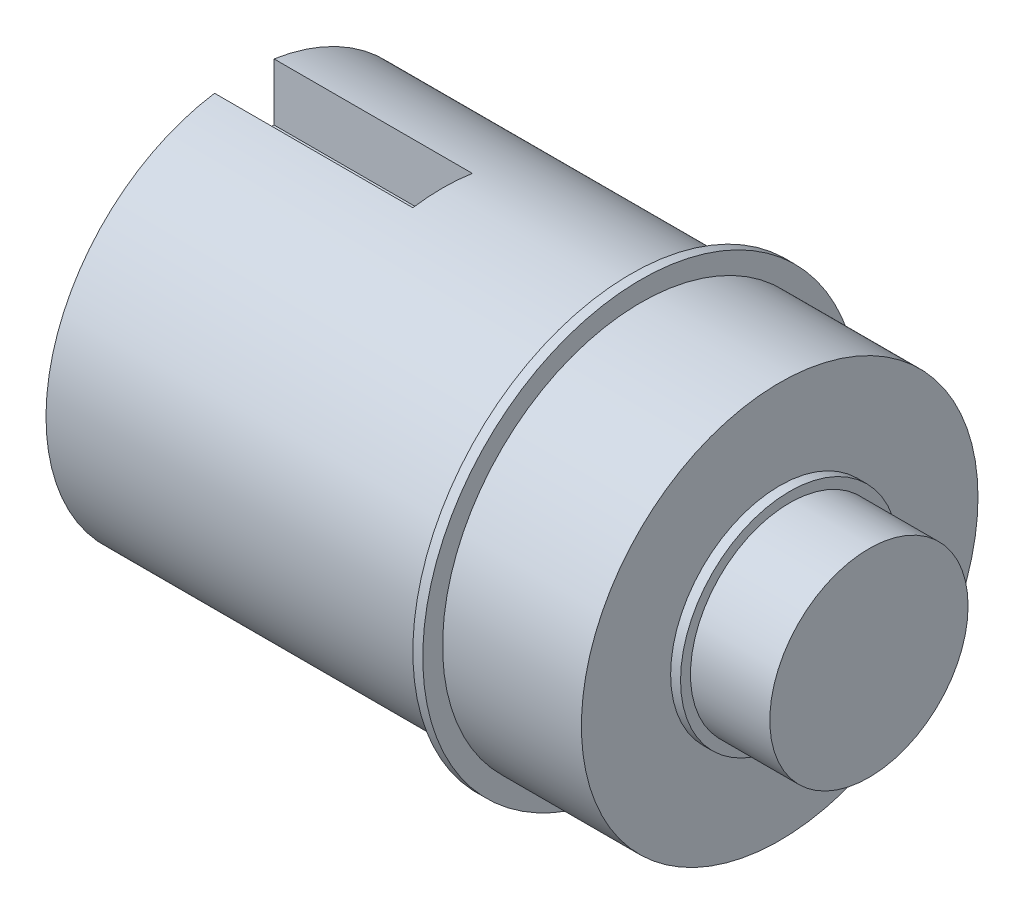
ISO-10303-21;
HEADER;
FILE_DESCRIPTION(('STEP AP214'),'2;1');
FILE_NAME('part.step','',(''),(''),'','','');
FILE_SCHEMA(('AUTOMOTIVE_DESIGN { 1 0 10303 214 1 1 1 1 }'));
ENDSEC;
DATA;
#1=APPLICATION_CONTEXT('core data for automotive mechanical design processes');
#2=APPLICATION_PROTOCOL_DEFINITION('international standard','automotive_design',2000,#1);
#3=PRODUCT_CONTEXT('',#1,'mechanical');
#4=PRODUCT('Part','Part','',(#3));
#5=PRODUCT_RELATED_PRODUCT_CATEGORY('part','',(#4));
#6=PRODUCT_DEFINITION_FORMATION('','',#4);
#7=PRODUCT_DEFINITION_CONTEXT('part definition',#1,'design');
#8=PRODUCT_DEFINITION('design','',#6,#7);
#9=PRODUCT_DEFINITION_SHAPE('','',#8);
#10=(LENGTH_UNIT() NAMED_UNIT(*) SI_UNIT(.MILLI.,.METRE.));
#11=(NAMED_UNIT(*) PLANE_ANGLE_UNIT() SI_UNIT($,.RADIAN.));
#12=(NAMED_UNIT(*) SI_UNIT($,.STERADIAN.) SOLID_ANGLE_UNIT());
#13=UNCERTAINTY_MEASURE_WITH_UNIT(LENGTH_MEASURE(1.E-05),#10,'distance_accuracy_value','');
#14=(GEOMETRIC_REPRESENTATION_CONTEXT(3) GLOBAL_UNCERTAINTY_ASSIGNED_CONTEXT((#13)) GLOBAL_UNIT_ASSIGNED_CONTEXT((#10,
#11,#12)) REPRESENTATION_CONTEXT('',''));
#15=CARTESIAN_POINT('',(0.,0.,0.));
#16=DIRECTION('',(0.,0.,1.));
#17=DIRECTION('',(1.,0.,0.));
#18=AXIS2_PLACEMENT_3D('',#15,#16,#17);
#19=CARTESIAN_POINT('',(31.5,0.,0.));
#20=DIRECTION('',(-1.,0.,0.));
#21=DIRECTION('',(0.,0.,1.));
#22=AXIS2_PLACEMENT_3D('',#19,#20,#21);
#23=PLANE('',#22);
#24=CARTESIAN_POINT('',(31.5,0.,0.));
#25=DIRECTION('',(1.,0.,0.));
#26=DIRECTION('',(0.,0.,-1.));
#27=AXIS2_PLACEMENT_3D('',#24,#25,#26);
#28=CIRCLE('',#27,5.);
#29=CARTESIAN_POINT('',(31.5,0.,-5.));
#30=VERTEX_POINT('',#29);
#31=EDGE_CURVE('E135',#30,#30,#28,.T.);
#32=ORIENTED_EDGE('',*,*,#31,.T.);
#33=EDGE_LOOP('',(#32));
#34=FACE_BOUND('',#33,.T.);
#35=ADVANCED_FACE('F41',(#34),#23,.F.);
#36=CARTESIAN_POINT('',(0.,0.,0.));
#37=DIRECTION('',(1.,0.,0.));
#38=DIRECTION('',(0.,0.,-1.));
#39=AXIS2_PLACEMENT_3D('',#36,#37,#38);
#40=CYLINDRICAL_SURFACE('',#39,5.);
#41=ORIENTED_EDGE('',*,*,#31,.F.);
#42=EDGE_LOOP('',(#41));
#43=FACE_BOUND('',#42,.T.);
#44=CARTESIAN_POINT('',(27.5,0.,0.));
#45=DIRECTION('',(1.,0.,0.));
#46=DIRECTION('',(0.,0.,-1.));
#47=AXIS2_PLACEMENT_3D('',#44,#45,#46);
#48=CIRCLE('',#47,5.);
#49=CARTESIAN_POINT('',(27.5,0.,-5.));
#50=VERTEX_POINT('',#49);
#51=EDGE_CURVE('E132',#50,#50,#48,.T.);
#52=ORIENTED_EDGE('',*,*,#51,.T.);
#53=EDGE_LOOP('',(#52));
#54=FACE_BOUND('',#53,.T.);
#55=ADVANCED_FACE('F162',(#43,#54),#40,.T.);
#56=CARTESIAN_POINT('',(27.5,0.,0.));
#57=DIRECTION('',(-1.,0.,0.));
#58=DIRECTION('',(0.,0.,1.));
#59=AXIS2_PLACEMENT_3D('',#56,#57,#58);
#60=PLANE('',#59);
#61=ORIENTED_EDGE('',*,*,#51,.F.);
#62=EDGE_LOOP('',(#61));
#63=FACE_BOUND('',#62,.T.);
#64=CARTESIAN_POINT('',(27.5,0.,0.));
#65=DIRECTION('',(1.,0.,0.));
#66=DIRECTION('',(0.,0.,-1.));
#67=AXIS2_PLACEMENT_3D('',#64,#65,#66);
#68=CIRCLE('',#67,5.5);
#69=CARTESIAN_POINT('',(27.5,0.,-5.5));
#70=VERTEX_POINT('',#69);
#71=EDGE_CURVE('E129',#70,#70,#68,.T.);
#72=ORIENTED_EDGE('',*,*,#71,.T.);
#73=EDGE_LOOP('',(#72));
#74=FACE_BOUND('',#73,.T.);
#75=ADVANCED_FACE('F167',(#63,#74),#60,.F.);
#76=CARTESIAN_POINT('',(0.,0.,0.));
#77=DIRECTION('',(1.,0.,0.));
#78=DIRECTION('',(0.,0.,-1.));
#79=AXIS2_PLACEMENT_3D('',#76,#77,#78);
#80=CYLINDRICAL_SURFACE('',#79,5.5);
#81=ORIENTED_EDGE('',*,*,#71,.F.);
#82=EDGE_LOOP('',(#81));
#83=FACE_BOUND('',#82,.T.);
#84=CARTESIAN_POINT('',(27.,0.,0.));
#85=DIRECTION('',(1.,0.,0.));
#86=DIRECTION('',(0.,0.,-1.));
#87=AXIS2_PLACEMENT_3D('',#84,#85,#86);
#88=CIRCLE('',#87,5.5);
#89=CARTESIAN_POINT('',(27.,0.,-5.5));
#90=VERTEX_POINT('',#89);
#91=EDGE_CURVE('E126',#90,#90,#88,.T.);
#92=ORIENTED_EDGE('',*,*,#91,.T.);
#93=EDGE_LOOP('',(#92));
#94=FACE_BOUND('',#93,.T.);
#95=ADVANCED_FACE('F175',(#83,#94),#80,.T.);
#96=CARTESIAN_POINT('',(27.,0.,0.));
#97=DIRECTION('',(-1.,0.,0.));
#98=DIRECTION('',(0.,0.,1.));
#99=AXIS2_PLACEMENT_3D('',#96,#97,#98);
#100=PLANE('',#99);
#101=ORIENTED_EDGE('',*,*,#91,.F.);
#102=EDGE_LOOP('',(#101));
#103=FACE_BOUND('',#102,.T.);
#104=CARTESIAN_POINT('',(27.,0.,0.));
#105=DIRECTION('',(1.,0.,0.));
#106=DIRECTION('',(0.,0.,-1.));
#107=AXIS2_PLACEMENT_3D('',#104,#105,#106);
#108=CIRCLE('',#107,10.);
#109=CARTESIAN_POINT('',(27.,0.,-10.));
#110=VERTEX_POINT('',#109);
#111=EDGE_CURVE('E123',#110,#110,#108,.T.);
#112=ORIENTED_EDGE('',*,*,#111,.T.);
#113=EDGE_LOOP('',(#112));
#114=FACE_BOUND('',#113,.T.);
#115=ADVANCED_FACE('F159',(#103,#114),#100,.F.);
#116=CARTESIAN_POINT('',(0.,0.,0.));
#117=DIRECTION('',(1.,0.,0.));
#118=DIRECTION('',(0.,0.,-1.));
#119=AXIS2_PLACEMENT_3D('',#116,#117,#118);
#120=CYLINDRICAL_SURFACE('',#119,10.);
#121=ORIENTED_EDGE('',*,*,#111,.F.);
#122=EDGE_LOOP('',(#121));
#123=FACE_BOUND('',#122,.T.);
#124=CARTESIAN_POINT('',(20.,0.,0.));
#125=DIRECTION('',(1.,0.,0.));
#126=DIRECTION('',(0.,0.,-1.));
#127=AXIS2_PLACEMENT_3D('',#124,#125,#126);
#128=CIRCLE('',#127,10.);
#129=CARTESIAN_POINT('',(20.,0.,-10.));
#130=VERTEX_POINT('',#129);
#131=EDGE_CURVE('E120',#130,#130,#128,.T.);
#132=ORIENTED_EDGE('',*,*,#131,.T.);
#133=EDGE_LOOP('',(#132));
#134=FACE_BOUND('',#133,.T.);
#135=ADVANCED_FACE('F147',(#123,#134),#120,.T.);
#136=CARTESIAN_POINT('',(20.,0.,0.));
#137=DIRECTION('',(-1.,0.,0.));
#138=DIRECTION('',(0.,0.,1.));
#139=AXIS2_PLACEMENT_3D('',#136,#137,#138);
#140=PLANE('',#139);
#141=ORIENTED_EDGE('',*,*,#131,.F.);
#142=EDGE_LOOP('',(#141));
#143=FACE_BOUND('',#142,.T.);
#144=CARTESIAN_POINT('',(20.,0.,0.));
#145=DIRECTION('',(1.,0.,0.));
#146=DIRECTION('',(0.,0.,-1.));
#147=AXIS2_PLACEMENT_3D('',#144,#145,#146);
#148=CIRCLE('',#147,11.);
#149=CARTESIAN_POINT('',(20.,0.,-11.));
#150=VERTEX_POINT('',#149);
#151=EDGE_CURVE('E117',#150,#150,#148,.T.);
#152=ORIENTED_EDGE('',*,*,#151,.T.);
#153=EDGE_LOOP('',(#152));
#154=FACE_BOUND('',#153,.T.);
#155=ADVANCED_FACE('F158',(#143,#154),#140,.F.);
#156=CARTESIAN_POINT('',(0.,0.,0.));
#157=DIRECTION('',(1.,0.,0.));
#158=DIRECTION('',(0.,0.,-1.));
#159=AXIS2_PLACEMENT_3D('',#156,#157,#158);
#160=CYLINDRICAL_SURFACE('',#159,11.);
#161=ORIENTED_EDGE('',*,*,#151,.F.);
#162=EDGE_LOOP('',(#161));
#163=FACE_BOUND('',#162,.T.);
#164=CARTESIAN_POINT('',(19.5,0.,0.));
#165=DIRECTION('',(1.,0.,0.));
#166=DIRECTION('',(0.,0.,-1.));
#167=AXIS2_PLACEMENT_3D('',#164,#165,#166);
#168=CIRCLE('',#167,11.);
#169=CARTESIAN_POINT('',(19.5,0.,-11.));
#170=VERTEX_POINT('',#169);
#171=EDGE_CURVE('E114',#170,#170,#168,.T.);
#172=ORIENTED_EDGE('',*,*,#171,.T.);
#173=EDGE_LOOP('',(#172));
#174=FACE_BOUND('',#173,.T.);
#175=ADVANCED_FACE('F153',(#163,#174),#160,.T.);
#176=CARTESIAN_POINT('',(19.5,0.,0.));
#177=DIRECTION('',(1.,0.,0.));
#178=DIRECTION('',(0.,0.,-1.));
#179=AXIS2_PLACEMENT_3D('',#176,#177,#178);
#180=PLANE('',#179);
#181=ORIENTED_EDGE('',*,*,#171,.F.);
#182=EDGE_LOOP('',(#181));
#183=FACE_BOUND('',#182,.T.);
#184=CARTESIAN_POINT('',(19.5,0.,0.));
#185=DIRECTION('',(1.,0.,0.));
#186=DIRECTION('',(0.,0.,-1.));
#187=AXIS2_PLACEMENT_3D('',#184,#185,#186);
#188=CIRCLE('',#187,10.);
#189=CARTESIAN_POINT('',(19.5,0.,-10.));
#190=VERTEX_POINT('',#189);
#191=EDGE_CURVE('E111',#190,#190,#188,.T.);
#192=ORIENTED_EDGE('',*,*,#191,.T.);
#193=EDGE_LOOP('',(#192));
#194=FACE_BOUND('',#193,.T.);
#195=ADVANCED_FACE('F144',(#183,#194),#180,.F.);
#196=ORIENTED_EDGE('',*,*,#191,.F.);
#197=EDGE_LOOP('',(#196));
#198=FACE_BOUND('',#197,.T.);
#199=CARTESIAN_POINT('',(10.,0.,0.));
#200=DIRECTION('',(1.,0.,0.));
#201=DIRECTION('',(0.,0.,-1.));
#202=AXIS2_PLACEMENT_3D('',#199,#200,#201);
#203=CIRCLE('',#202,10.);
#204=CARTESIAN_POINT('',(10.,9.88685996664259,-1.5));
#205=VERTEX_POINT('',#204);
#206=CARTESIAN_POINT('',(10.,9.88685996664259,1.5));
#207=VERTEX_POINT('',#206);
#208=EDGE_CURVE('E11',#205,#207,#203,.T.);
#209=ORIENTED_EDGE('',*,*,#208,.T.);
#210=DIRECTION('',(1.,0.,0.));
#211=VECTOR('',#210,1.);
#212=CARTESIAN_POINT('',(0.,9.88685996664259,1.5));
#213=LINE('',#212,#211);
#214=CARTESIAN_POINT('',(0.,9.88685996664259,1.5));
#215=VERTEX_POINT('',#214);
#216=EDGE_CURVE('E63',#207,#215,#213,.F.);
#217=ORIENTED_EDGE('',*,*,#216,.T.);
#218=CARTESIAN_POINT('',(0.,0.,0.));
#219=DIRECTION('',(1.,0.,0.));
#220=DIRECTION('',(0.,0.,-1.));
#221=AXIS2_PLACEMENT_3D('',#218,#219,#220);
#222=CIRCLE('',#221,10.);
#223=CARTESIAN_POINT('',(0.,9.88685996664259,-1.5));
#224=VERTEX_POINT('',#223);
#225=EDGE_CURVE('E108',#215,#224,#222,.T.);
#226=ORIENTED_EDGE('',*,*,#225,.T.);
#227=DIRECTION('',(1.,0.,0.));
#228=VECTOR('',#227,1.);
#229=CARTESIAN_POINT('',(0.,9.88685996664259,-1.5));
#230=LINE('',#229,#228);
#231=EDGE_CURVE('E55',#224,#205,#230,.T.);
#232=ORIENTED_EDGE('',*,*,#231,.T.);
#233=EDGE_LOOP('',(#209,#217,#226,#232));
#234=FACE_BOUND('',#233,.T.);
#235=ADVANCED_FACE('F142',(#198,#234),#120,.T.);
#236=CARTESIAN_POINT('',(0.,0.,0.));
#237=DIRECTION('',(1.,0.,0.));
#238=DIRECTION('',(0.,0.,-1.));
#239=AXIS2_PLACEMENT_3D('',#236,#237,#238);
#240=PLANE('',#239);
#241=ORIENTED_EDGE('',*,*,#225,.F.);
#242=DIRECTION('',(0.,1.,0.));
#243=VECTOR('',#242,1.);
#244=CARTESIAN_POINT('',(0.,7.,1.5));
#245=LINE('',#244,#243);
#246=CARTESIAN_POINT('',(0.,7.,1.5));
#247=VERTEX_POINT('',#246);
#248=EDGE_CURVE('E101',#247,#215,#245,.T.);
#249=ORIENTED_EDGE('',*,*,#248,.F.);
#250=DIRECTION('',(0.,0.,1.));
#251=VECTOR('',#250,1.);
#252=CARTESIAN_POINT('',(0.,7.,-1.5));
#253=LINE('',#252,#251);
#254=CARTESIAN_POINT('',(0.,7.,-1.5));
#255=VERTEX_POINT('',#254);
#256=EDGE_CURVE('E103',#255,#247,#253,.T.);
#257=ORIENTED_EDGE('',*,*,#256,.F.);
#258=DIRECTION('',(0.,1.,0.));
#259=VECTOR('',#258,1.);
#260=CARTESIAN_POINT('',(0.,0.,-1.5));
#261=LINE('',#260,#259);
#262=EDGE_CURVE('E48',#255,#224,#261,.T.);
#263=ORIENTED_EDGE('',*,*,#262,.T.);
#264=EDGE_LOOP('',(#241,#249,#257,#263));
#265=FACE_BOUND('',#264,.T.);
#266=ADVANCED_FACE('F139',(#265),#240,.F.);
#267=CARTESIAN_POINT('',(10.,0.,0.));
#268=DIRECTION('',(1.,0.,0.));
#269=DIRECTION('',(0.,0.,-1.));
#270=AXIS2_PLACEMENT_3D('',#267,#268,#269);
#271=PLANE('',#270);
#272=DIRECTION('',(0.,-1.,0.));
#273=VECTOR('',#272,1.);
#274=CARTESIAN_POINT('',(10.,7.,-1.5));
#275=LINE('',#274,#273);
#276=CARTESIAN_POINT('',(10.,7.,-1.5));
#277=VERTEX_POINT('',#276);
#278=EDGE_CURVE('E82',#205,#277,#275,.T.);
#279=ORIENTED_EDGE('',*,*,#278,.T.);
#280=DIRECTION('',(0.,0.,1.));
#281=VECTOR('',#280,1.);
#282=CARTESIAN_POINT('',(10.,7.,-1.5));
#283=LINE('',#282,#281);
#284=CARTESIAN_POINT('',(10.,7.,1.5));
#285=VERTEX_POINT('',#284);
#286=EDGE_CURVE('E86',#277,#285,#283,.T.);
#287=ORIENTED_EDGE('',*,*,#286,.T.);
#288=DIRECTION('',(0.,1.,0.));
#289=VECTOR('',#288,1.);
#290=CARTESIAN_POINT('',(10.,7.,1.5));
#291=LINE('',#290,#289);
#292=EDGE_CURVE('E87',#285,#207,#291,.T.);
#293=ORIENTED_EDGE('',*,*,#292,.T.);
#294=ORIENTED_EDGE('',*,*,#208,.F.);
#295=EDGE_LOOP('',(#279,#287,#293,#294));
#296=FACE_BOUND('',#295,.T.);
#297=ADVANCED_FACE('F84',(#296),#271,.F.);
#298=CARTESIAN_POINT('',(10.,7.,1.5));
#299=DIRECTION('',(0.,0.,1.));
#300=DIRECTION('',(0.,-1.,0.));
#301=AXIS2_PLACEMENT_3D('',#298,#299,#300);
#302=PLANE('',#301);
#303=ORIENTED_EDGE('',*,*,#292,.F.);
#304=DIRECTION('',(-1.,0.,0.));
#305=VECTOR('',#304,1.);
#306=CARTESIAN_POINT('',(10.,7.,1.5));
#307=LINE('',#306,#305);
#308=EDGE_CURVE('E95',#285,#247,#307,.T.);
#309=ORIENTED_EDGE('',*,*,#308,.T.);
#310=ORIENTED_EDGE('',*,*,#248,.T.);
#311=ORIENTED_EDGE('',*,*,#216,.F.);
#312=EDGE_LOOP('',(#303,#309,#310,#311));
#313=FACE_BOUND('',#312,.T.);
#314=ADVANCED_FACE('F230',(#313),#302,.F.);
#315=CARTESIAN_POINT('',(10.,7.,-1.5));
#316=DIRECTION('',(0.,0.,-1.));
#317=DIRECTION('',(0.,1.,0.));
#318=AXIS2_PLACEMENT_3D('',#315,#316,#317);
#319=PLANE('',#318);
#320=ORIENTED_EDGE('',*,*,#262,.F.);
#321=DIRECTION('',(-1.,0.,0.));
#322=VECTOR('',#321,1.);
#323=CARTESIAN_POINT('',(10.,7.,-1.5));
#324=LINE('',#323,#322);
#325=EDGE_CURVE('E90',#277,#255,#324,.T.);
#326=ORIENTED_EDGE('',*,*,#325,.F.);
#327=ORIENTED_EDGE('',*,*,#278,.F.);
#328=ORIENTED_EDGE('',*,*,#231,.F.);
#329=EDGE_LOOP('',(#320,#326,#327,#328));
#330=FACE_BOUND('',#329,.T.);
#331=ADVANCED_FACE('F91',(#330),#319,.F.);
#332=CARTESIAN_POINT('',(10.,7.,-1.5));
#333=DIRECTION('',(0.,-1.,0.));
#334=DIRECTION('',(0.,0.,-1.));
#335=AXIS2_PLACEMENT_3D('',#332,#333,#334);
#336=PLANE('',#335);
#337=ORIENTED_EDGE('',*,*,#256,.T.);
#338=ORIENTED_EDGE('',*,*,#308,.F.);
#339=ORIENTED_EDGE('',*,*,#286,.F.);
#340=ORIENTED_EDGE('',*,*,#325,.T.);
#341=EDGE_LOOP('',(#337,#338,#339,#340));
#342=FACE_BOUND('',#341,.T.);
#343=ADVANCED_FACE('F97',(#342),#336,.F.);
#344=CLOSED_SHELL('',(#35,#55,#75,#95,#115,#135,#155,#175,#195,#235,#266,#297,#314,#331,#343));
#345=MANIFOLD_SOLID_BREP('B2',#344);
#346=ADVANCED_BREP_SHAPE_REPRESENTATION('',(#18,#345),#14);
#347=SHAPE_DEFINITION_REPRESENTATION(#9,#346);
ENDSEC;
END-ISO-10303-21;
